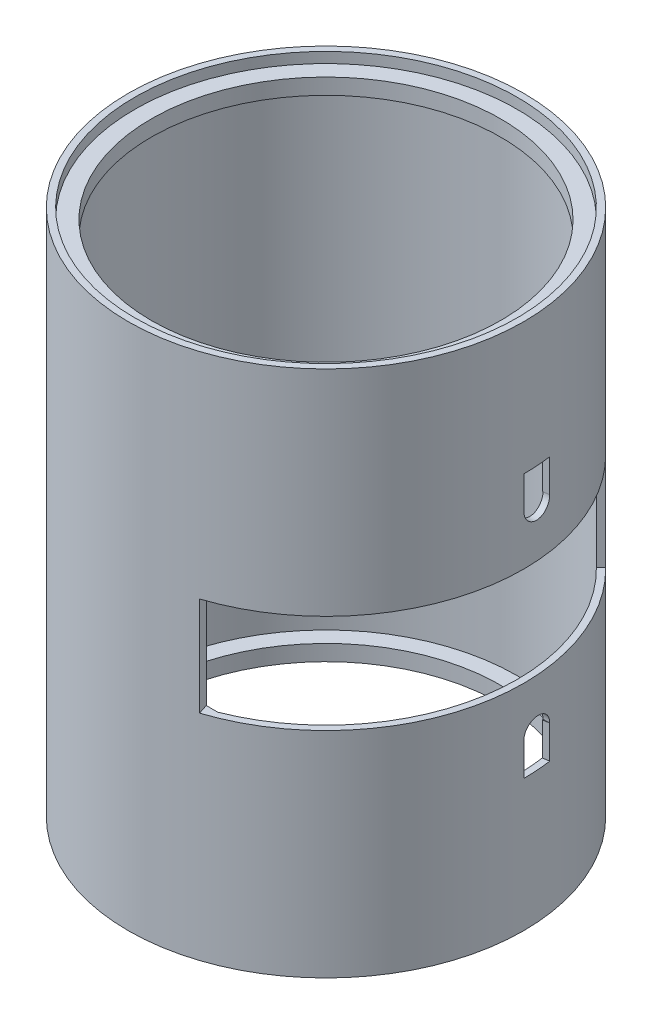
ISO-10303-21;
HEADER;
FILE_DESCRIPTION(('STEP AP214'),'2;1');
FILE_NAME('part.step','',(''),(''),'','','');
FILE_SCHEMA(('AUTOMOTIVE_DESIGN { 1 0 10303 214 1 1 1 1 }'));
ENDSEC;
DATA;
#1=APPLICATION_CONTEXT('core data for automotive mechanical design processes');
#2=APPLICATION_PROTOCOL_DEFINITION('international standard','automotive_design',2000,#1);
#3=PRODUCT_CONTEXT('',#1,'mechanical');
#4=PRODUCT('Part','Part','',(#3));
#5=PRODUCT_RELATED_PRODUCT_CATEGORY('part','',(#4));
#6=PRODUCT_DEFINITION_FORMATION('','',#4);
#7=PRODUCT_DEFINITION_CONTEXT('part definition',#1,'design');
#8=PRODUCT_DEFINITION('design','',#6,#7);
#9=PRODUCT_DEFINITION_SHAPE('','',#8);
#10=(LENGTH_UNIT() NAMED_UNIT(*) SI_UNIT(.MILLI.,.METRE.));
#11=(NAMED_UNIT(*) PLANE_ANGLE_UNIT() SI_UNIT($,.RADIAN.));
#12=(NAMED_UNIT(*) SI_UNIT($,.STERADIAN.) SOLID_ANGLE_UNIT());
#13=UNCERTAINTY_MEASURE_WITH_UNIT(LENGTH_MEASURE(1.E-05),#10,'distance_accuracy_value','');
#14=(GEOMETRIC_REPRESENTATION_CONTEXT(3) GLOBAL_UNCERTAINTY_ASSIGNED_CONTEXT((#13)) GLOBAL_UNIT_ASSIGNED_CONTEXT((#10,
#11,#12)) REPRESENTATION_CONTEXT('',''));
#15=CARTESIAN_POINT('',(0.,0.,0.));
#16=DIRECTION('',(0.,0.,1.));
#17=DIRECTION('',(1.,0.,0.));
#18=AXIS2_PLACEMENT_3D('',#15,#16,#17);
#19=CARTESIAN_POINT('',(0.,66.,0.));
#20=DIRECTION('',(0.,1.,0.));
#21=DIRECTION('',(0.,0.,1.));
#22=AXIS2_PLACEMENT_3D('',#19,#20,#21);
#23=CYLINDRICAL_SURFACE('',#22,29.);
#24=DIRECTION('',(0.,1.,0.));
#25=VECTOR('',#24,1.);
#26=CARTESIAN_POINT('',(28.70922832913,66.,-4.0963653091344));
#27=LINE('',#26,#25);
#28=CARTESIAN_POINT('',(28.70922832913,-15.,-4.0963653091344));
#29=VERTEX_POINT('',#28);
#30=CARTESIAN_POINT('',(28.70922832913,-20.,-4.0963653091344));
#31=VERTEX_POINT('',#30);
#32=EDGE_CURVE('E192',#29,#31,#27,.F.);
#33=ORIENTED_EDGE('',*,*,#32,.F.);
#34=CARTESIAN_POINT('',(0.,-15.,0.));
#35=DIRECTION('',(0.,-1.,0.));
#36=DIRECTION('',(0.,0.,-1.));
#37=AXIS2_PLACEMENT_3D('',#34,#35,#36);
#38=CIRCLE('',#37,29.);
#39=CARTESIAN_POINT('',(28.6887187373845,-15.,-4.23761928531155));
#40=VERTEX_POINT('',#39);
#41=EDGE_CURVE('E167',#29,#40,#38,.F.);
#42=ORIENTED_EDGE('',*,*,#41,.T.);
#43=CARTESIAN_POINT('',(28.6887187373845,-15.,-4.23761928531155));
#44=CARTESIAN_POINT('',(28.6887163589977,-14.9407150323902,-4.2376259303107));
#45=CARTESIAN_POINT('',(28.6890858616931,-14.8814312807168,-4.23513355215698));
#46=CARTESIAN_POINT('',(28.6905516992259,-14.7632685932158,-4.22519702092967));
#47=CARTESIAN_POINT('',(28.6916482831609,-14.7043898031151,-4.21775117079742));
#48=CARTESIAN_POINT('',(28.6945452791887,-14.587724371142,-4.19799529964819));
#49=CARTESIAN_POINT('',(28.6963427376136,-14.5299341991555,-4.18570568918496));
#50=CARTESIAN_POINT('',(28.7006075375052,-14.415630159259,-4.15636234677299));
#51=CARTESIAN_POINT('',(28.7030745801993,-14.359115734256,-4.13931073955937));
#52=CARTESIAN_POINT('',(28.7086024750182,-14.2483975261527,-4.10079470748535));
#53=CARTESIAN_POINT('',(28.7116558642416,-14.1941741798737,-4.07938555846366));
#54=CARTESIAN_POINT('',(28.7183198611446,-14.0877315464579,-4.03220418607597));
#55=CARTESIAN_POINT('',(28.7219303062085,-14.035511680003,-4.00643323579366));
#56=CARTESIAN_POINT('',(28.7335121494409,-13.8823542567541,-3.92281213685447));
#57=CARTESIAN_POINT('',(28.742238280664,-13.7848365176275,-3.85862499028679));
#58=CARTESIAN_POINT('',(28.761124681722,-13.6018035493329,-3.71522792727884));
#59=CARTESIAN_POINT('',(28.771284919382,-13.5162880509752,-3.63601834785989));
#60=CARTESIAN_POINT('',(28.7924191294219,-13.3594574757271,-3.46468416541786));
#61=CARTESIAN_POINT('',(28.8033930922198,-13.2881422316613,-3.37255971445956));
#62=CARTESIAN_POINT('',(28.8255232197304,-13.1616323985989,-3.17786047894853));
#63=CARTESIAN_POINT('',(28.8366793846844,-13.1064378309462,-3.0752856805597));
#64=CARTESIAN_POINT('',(28.8585867879493,-13.0136625371226,-2.86241263348916));
#65=CARTESIAN_POINT('',(28.869338021028,-12.9760820384755,-2.75211428506225));
#66=CARTESIAN_POINT('',(28.8899348411311,-12.9195922929702,-2.52674908069653));
#67=CARTESIAN_POINT('',(28.8997804101546,-12.9006834171577,-2.41168213004262));
#68=CARTESIAN_POINT('',(28.9181872862745,-12.8821060838537,-2.17989836631849));
#69=CARTESIAN_POINT('',(28.9267485667889,-12.882438024554,-2.06318151915338));
#70=CARTESIAN_POINT('',(28.9423538057861,-12.9023867299245,-1.83130055071363));
#71=CARTESIAN_POINT('',(28.9493977401963,-12.9220038005261,-1.71613645410056));
#72=CARTESIAN_POINT('',(28.9618885790109,-12.9800172148543,-1.49056229278237));
#73=CARTESIAN_POINT('',(28.9673356649018,-13.0184114231798,-1.38015168904667));
#74=CARTESIAN_POINT('',(28.976700574414,-13.1129355400831,-1.16713398335495));
#75=CARTESIAN_POINT('',(28.9806184001735,-13.1690654238645,-1.06452687048905));
#76=CARTESIAN_POINT('',(28.987112073701,-13.2975113716007,-0.869955930675817));
#77=CARTESIAN_POINT('',(28.9896879326261,-13.369827300977,-0.777992015245458));
#78=CARTESIAN_POINT('',(28.9937678599104,-13.5286421056691,-0.607235169945661));
#79=CARTESIAN_POINT('',(28.9952719409563,-13.6151408130849,-0.528442084178218));
#80=CARTESIAN_POINT('',(28.9975162144236,-13.7999396748211,-0.386173662927937));
#81=CARTESIAN_POINT('',(28.9982564160054,-13.8982396876048,-0.322698143764277));
#82=CARTESIAN_POINT('',(28.9992716464428,-14.103927999631,-0.212781683407579));
#83=CARTESIAN_POINT('',(28.999546679863,-14.2113162096814,-0.166340575061748));
#84=CARTESIAN_POINT('',(28.9998766274632,-14.4306387742128,-0.092301829126664));
#85=CARTESIAN_POINT('',(28.9999348147631,-14.5424795535625,-0.0644292536975952));
#86=CARTESIAN_POINT('',(28.999978433065,-14.7126185610112,-0.0364284877754208));
#87=CARTESIAN_POINT('',(28.9999856623384,-14.7698583878466,-0.0293961013521217));
#88=CARTESIAN_POINT('',(28.9999932935772,-14.884723660365,-0.0200115674832832));
#89=CARTESIAN_POINT('',(28.9999936951679,-14.9423491270448,-0.017659676988006));
#90=CARTESIAN_POINT('',(28.9999946231997,-15.,-0.0176593994366393));
#91=B_SPLINE_CURVE_WITH_KNOTS('',3,(#43,#44,#45,#46,#47,#48,#49,#50,#51,#52,#53,#54,#55,#56,#57,
#58,#59,#60,#61,#62,#63,#64,#65,#66,#67,#68,#69,#70,#71,#72,#73,#74,#75,#76,#77,#78,#79,#80,#81,
#82,#83,#84,#85,#86,#87,#88,#89,#90),.UNSPECIFIED.,.F.,.F.,(4,2,2,2,2,2,2,2,2,2,2,2,2,2,2,2,2,2,
2,2,2,2,2,4),(0.,0.177799626337657,0.355660198188265,0.532779182220553,0.709819264201134,
0.884739763575617,1.05960929647825,1.40908954213309,1.75856194828796,2.10803023996313,
2.45749899433526,2.80697226272767,3.15645247577147,3.50593992136609,3.8554329111738,
4.20488616466603,4.55433892958619,4.90378878909565,5.25323451200965,5.60267604433194,
5.95211414761337,6.29625588800382,6.4691005598412,6.6419547202583),.UNSPECIFIED.);
#92=CARTESIAN_POINT('',(28.9999946231997,-15.,-0.0176593994366396));
#93=VERTEX_POINT('',#92);
#94=EDGE_CURVE('E178',#40,#93,#91,.T.);
#95=ORIENTED_EDGE('',*,*,#94,.T.);
#96=CARTESIAN_POINT('',(0.,-15.,0.));
#97=DIRECTION('',(0.,-1.,0.));
#98=DIRECTION('',(0.,0.,-1.));
#99=AXIS2_PLACEMENT_3D('',#96,#97,#98);
#100=CIRCLE('',#99,29.);
#101=CARTESIAN_POINT('',(28.9999949756789,-15.,-0.0170707527887516));
#102=VERTEX_POINT('',#101);
#103=EDGE_CURVE('E476',#102,#93,#100,.F.);
#104=ORIENTED_EDGE('',*,*,#103,.F.);
#105=DIRECTION('',(0.,1.,0.));
#106=VECTOR('',#105,1.);
#107=CARTESIAN_POINT('',(28.9999949756789,66.,-0.0170707527887516));
#108=LINE('',#107,#106);
#109=CARTESIAN_POINT('',(28.9999949756789,-20.,-0.0170707527887516));
#110=VERTEX_POINT('',#109);
#111=EDGE_CURVE('E201',#110,#102,#108,.T.);
#112=ORIENTED_EDGE('',*,*,#111,.F.);
#113=CARTESIAN_POINT('',(0.,-20.,0.));
#114=DIRECTION('',(0.,-1.,0.));
#115=DIRECTION('',(0.,0.,-1.));
#116=AXIS2_PLACEMENT_3D('',#113,#114,#115);
#117=CIRCLE('',#116,29.);
#118=EDGE_CURVE('E388',#110,#31,#117,.F.);
#119=ORIENTED_EDGE('',*,*,#118,.T.);
#120=EDGE_LOOP('',(#33,#42,#95,#104,#112,#119));
#121=FACE_BOUND('',#120,.T.);
#122=CARTESIAN_POINT('',(0.,7.5,0.));
#123=DIRECTION('',(0.,-1.,0.));
#124=DIRECTION('',(0.,0.,-1.));
#125=AXIS2_PLACEMENT_3D('',#122,#123,#124);
#126=CIRCLE('',#125,29.);
#127=CARTESIAN_POINT('',(10.5830052442584,7.5,27.));
#128=VERTEX_POINT('',#127);
#129=CARTESIAN_POINT('',(20.3182089521525,7.5,-20.6922783901791));
#130=VERTEX_POINT('',#129);
#131=EDGE_CURVE('E351',#128,#130,#126,.F.);
#132=ORIENTED_EDGE('',*,*,#131,.F.);
#133=DIRECTION('',(0.,1.,0.));
#134=VECTOR('',#133,1.);
#135=CARTESIAN_POINT('',(10.5830052442584,66.,27.));
#136=LINE('',#135,#134);
#137=CARTESIAN_POINT('',(10.5830052442584,36.,27.));
#138=VERTEX_POINT('',#137);
#139=EDGE_CURVE('E335',#138,#128,#136,.F.);
#140=ORIENTED_EDGE('',*,*,#139,.F.);
#141=CARTESIAN_POINT('',(0.,36.,0.));
#142=DIRECTION('',(0.,1.,0.));
#143=DIRECTION('',(0.,0.,1.));
#144=AXIS2_PLACEMENT_3D('',#141,#142,#143);
#145=CIRCLE('',#144,29.);
#146=CARTESIAN_POINT('',(-10.5830052442584,36.,27.));
#147=VERTEX_POINT('',#146);
#148=EDGE_CURVE('E306',#138,#147,#145,.T.);
#149=ORIENTED_EDGE('',*,*,#148,.T.);
#150=DIRECTION('',(0.,1.,0.));
#151=VECTOR('',#150,1.);
#152=CARTESIAN_POINT('',(-10.5830052442584,66.,27.));
#153=LINE('',#152,#151);
#154=CARTESIAN_POINT('',(-10.5830052442584,-36.,27.));
#155=VERTEX_POINT('',#154);
#156=EDGE_CURVE('E339',#155,#147,#153,.T.);
#157=ORIENTED_EDGE('',*,*,#156,.F.);
#158=CARTESIAN_POINT('',(0.,-36.,0.));
#159=DIRECTION('',(0.,1.,0.));
#160=DIRECTION('',(0.,0.,1.));
#161=AXIS2_PLACEMENT_3D('',#158,#159,#160);
#162=CIRCLE('',#161,29.);
#163=CARTESIAN_POINT('',(10.5830052442584,-36.,27.));
#164=VERTEX_POINT('',#163);
#165=EDGE_CURVE('E324',#164,#155,#162,.T.);
#166=ORIENTED_EDGE('',*,*,#165,.F.);
#167=CARTESIAN_POINT('',(10.5830052442584,-7.50000000000001,27.));
#168=VERTEX_POINT('',#167);
#169=EDGE_CURVE('E338',#168,#164,#136,.F.);
#170=ORIENTED_EDGE('',*,*,#169,.F.);
#171=CARTESIAN_POINT('',(0.,-7.50000000000001,0.));
#172=DIRECTION('',(0.,-1.,0.));
#173=DIRECTION('',(0.,0.,-1.));
#174=AXIS2_PLACEMENT_3D('',#171,#172,#173);
#175=CIRCLE('',#174,29.);
#176=CARTESIAN_POINT('',(20.3182089521525,-7.50000000000001,-20.6922783901791));
#177=VERTEX_POINT('',#176);
#178=EDGE_CURVE('E356',#168,#177,#175,.F.);
#179=ORIENTED_EDGE('',*,*,#178,.T.);
#180=DIRECTION('',(0.,1.,0.));
#181=VECTOR('',#180,1.);
#182=CARTESIAN_POINT('',(20.3182089521525,66.,-20.6922783901791));
#183=LINE('',#182,#181);
#184=EDGE_CURVE('E344',#130,#177,#183,.F.);
#185=ORIENTED_EDGE('',*,*,#184,.F.);
#186=EDGE_LOOP('',(#132,#140,#149,#157,#166,#170,#179,#185));
#187=FACE_BOUND('',#186,.T.);
#188=CARTESIAN_POINT('',(0.,15.,0.));
#189=DIRECTION('',(0.,-1.,0.));
#190=DIRECTION('',(0.,0.,-1.));
#191=AXIS2_PLACEMENT_3D('',#188,#189,#190);
#192=CIRCLE('',#191,29.);
#193=CARTESIAN_POINT('',(28.70922832913,15.,-4.09636530913441));
#194=VERTEX_POINT('',#193);
#195=CARTESIAN_POINT('',(28.6887187373845,15.,-4.23761928531155));
#196=VERTEX_POINT('',#195);
#197=EDGE_CURVE('E257',#194,#196,#192,.F.);
#198=ORIENTED_EDGE('',*,*,#197,.F.);
#199=DIRECTION('',(0.,1.,0.));
#200=VECTOR('',#199,1.);
#201=CARTESIAN_POINT('',(28.70922832913,66.,-4.0963653091344));
#202=LINE('',#201,#200);
#203=CARTESIAN_POINT('',(28.70922832913,20.,-4.0963653091344));
#204=VERTEX_POINT('',#203);
#205=EDGE_CURVE('E273',#194,#204,#202,.T.);
#206=ORIENTED_EDGE('',*,*,#205,.T.);
#207=CARTESIAN_POINT('',(0.,20.,0.));
#208=DIRECTION('',(0.,1.,0.));
#209=DIRECTION('',(0.,0.,1.));
#210=AXIS2_PLACEMENT_3D('',#207,#208,#209);
#211=CIRCLE('',#210,29.);
#212=CARTESIAN_POINT('',(28.9999949756789,20.,-0.0170707527887516));
#213=VERTEX_POINT('',#212);
#214=EDGE_CURVE('E370',#204,#213,#211,.F.);
#215=ORIENTED_EDGE('',*,*,#214,.T.);
#216=DIRECTION('',(0.,1.,0.));
#217=VECTOR('',#216,1.);
#218=CARTESIAN_POINT('',(28.9999949756789,66.,-0.0170707527887516));
#219=LINE('',#218,#217);
#220=CARTESIAN_POINT('',(28.9999949756789,15.,-0.0170707527887516));
#221=VERTEX_POINT('',#220);
#222=EDGE_CURVE('E375',#213,#221,#219,.F.);
#223=ORIENTED_EDGE('',*,*,#222,.T.);
#224=CARTESIAN_POINT('',(0.,15.,0.));
#225=DIRECTION('',(0.,1.,0.));
#226=DIRECTION('',(0.,0.,1.));
#227=AXIS2_PLACEMENT_3D('',#224,#225,#226);
#228=CIRCLE('',#227,29.);
#229=CARTESIAN_POINT('',(28.9999946231997,15.,-0.0176593994366396));
#230=VERTEX_POINT('',#229);
#231=EDGE_CURVE('E373',#230,#221,#228,.F.);
#232=ORIENTED_EDGE('',*,*,#231,.F.);
#233=CARTESIAN_POINT('',(28.6887187373845,15.,-4.23761928531155));
#234=CARTESIAN_POINT('',(28.6887163589977,14.9407150323902,-4.2376259303107));
#235=CARTESIAN_POINT('',(28.6890858616931,14.8814312807168,-4.23513355215698));
#236=CARTESIAN_POINT('',(28.6905516992259,14.7632685932158,-4.22519702092967));
#237=CARTESIAN_POINT('',(28.6916482831609,14.7043898031151,-4.21775117079742));
#238=CARTESIAN_POINT('',(28.6945452791887,14.587724371142,-4.19799529964819));
#239=CARTESIAN_POINT('',(28.6963427376136,14.5299341991555,-4.18570568918496));
#240=CARTESIAN_POINT('',(28.7006075375052,14.415630159259,-4.15636234677299));
#241=CARTESIAN_POINT('',(28.7030745801993,14.359115734256,-4.13931073955937));
#242=CARTESIAN_POINT('',(28.7086024750182,14.2483975261527,-4.10079470748535));
#243=CARTESIAN_POINT('',(28.7116558642416,14.1941741798737,-4.07938555846366));
#244=CARTESIAN_POINT('',(28.7183198611446,14.0877315464579,-4.03220418607597));
#245=CARTESIAN_POINT('',(28.7219303062085,14.035511680003,-4.00643323579366));
#246=CARTESIAN_POINT('',(28.7335121494409,13.8823542567541,-3.92281213685447));
#247=CARTESIAN_POINT('',(28.742238280664,13.7848365176275,-3.85862499028679));
#248=CARTESIAN_POINT('',(28.761124681722,13.6018035493329,-3.71522792727884));
#249=CARTESIAN_POINT('',(28.771284919382,13.5162880509752,-3.63601834785989));
#250=CARTESIAN_POINT('',(28.7924191294219,13.3594574757271,-3.46468416541786));
#251=CARTESIAN_POINT('',(28.8033930922198,13.2881422316613,-3.37255971445956));
#252=CARTESIAN_POINT('',(28.8255232197304,13.1616323985989,-3.17786047894853));
#253=CARTESIAN_POINT('',(28.8366793846844,13.1064378309462,-3.0752856805597));
#254=CARTESIAN_POINT('',(28.8585867879493,13.0136625371226,-2.86241263348916));
#255=CARTESIAN_POINT('',(28.869338021028,12.9760820384755,-2.75211428506225));
#256=CARTESIAN_POINT('',(28.8899348411311,12.9195922929702,-2.52674908069653));
#257=CARTESIAN_POINT('',(28.8997804101546,12.9006834171577,-2.41168213004262));
#258=CARTESIAN_POINT('',(28.9181872862745,12.8821060838537,-2.17989836631849));
#259=CARTESIAN_POINT('',(28.9267485667889,12.882438024554,-2.06318151915338));
#260=CARTESIAN_POINT('',(28.9423538057861,12.9023867299245,-1.83130055071363));
#261=CARTESIAN_POINT('',(28.9493977401963,12.9220038005261,-1.71613645410056));
#262=CARTESIAN_POINT('',(28.9618885790109,12.9800172148543,-1.49056229278237));
#263=CARTESIAN_POINT('',(28.9673356649018,13.0184114231798,-1.38015168904667));
#264=CARTESIAN_POINT('',(28.976700574414,13.1129355400831,-1.16713398335495));
#265=CARTESIAN_POINT('',(28.9806184001735,13.1690654238645,-1.06452687048905));
#266=CARTESIAN_POINT('',(28.987112073701,13.2975113716007,-0.869955930675817));
#267=CARTESIAN_POINT('',(28.9896879326261,13.369827300977,-0.777992015245458));
#268=CARTESIAN_POINT('',(28.9937678599104,13.5286421056691,-0.607235169945661));
#269=CARTESIAN_POINT('',(28.9952719409563,13.6151408130849,-0.528442084178218));
#270=CARTESIAN_POINT('',(28.9975162144236,13.7999396748211,-0.386173662927937));
#271=CARTESIAN_POINT('',(28.9982564160054,13.8982396876048,-0.322698143764277));
#272=CARTESIAN_POINT('',(28.9992716464428,14.103927999631,-0.212781683407579));
#273=CARTESIAN_POINT('',(28.999546679863,14.2113162096814,-0.166340575061748));
#274=CARTESIAN_POINT('',(28.9998766274632,14.4306387742128,-0.092301829126664));
#275=CARTESIAN_POINT('',(28.9999348147631,14.5424795535625,-0.0644292536975952));
#276=CARTESIAN_POINT('',(28.999978433065,14.7126185610112,-0.0364284877754208));
#277=CARTESIAN_POINT('',(28.9999856623384,14.7698583878466,-0.0293961013521217));
#278=CARTESIAN_POINT('',(28.9999932935772,14.884723660365,-0.0200115674832832));
#279=CARTESIAN_POINT('',(28.9999936951679,14.9423491270448,-0.017659676988006));
#280=CARTESIAN_POINT('',(28.9999946231997,15.,-0.0176593994366393));
#281=B_SPLINE_CURVE_WITH_KNOTS('',3,(#233,#234,#235,#236,#237,#238,#239,#240,#241,#242,#243,
#244,#245,#246,#247,#248,#249,#250,#251,#252,#253,#254,#255,#256,#257,#258,#259,#260,#261,#262,
#263,#264,#265,#266,#267,#268,#269,#270,#271,#272,#273,#274,#275,#276,#277,#278,#279,#280),
.UNSPECIFIED.,.F.,.F.,(4,2,2,2,2,2,2,2,2,2,2,2,2,2,2,2,2,2,2,2,2,2,2,4),(0.,0.177799626337657,
0.355660198188265,0.532779182220553,0.709819264201134,0.884739763575617,1.05960929647825,
1.40908954213309,1.75856194828796,2.10803023996313,2.45749899433526,2.80697226272767,
3.15645247577147,3.50593992136609,3.8554329111738,4.20488616466603,4.55433892958619,
4.90378878909565,5.25323451200965,5.60267604433194,5.95211414761337,6.29625588800382,
6.4691005598412,6.6419547202583),.UNSPECIFIED.);
#282=EDGE_CURVE('E195',#196,#230,#281,.T.);
#283=ORIENTED_EDGE('',*,*,#282,.F.);
#284=EDGE_LOOP('',(#198,#206,#215,#223,#232,#283));
#285=FACE_BOUND('',#284,.T.);
#286=ADVANCED_FACE('F41',(#121,#187,#285),#23,.F.);
#287=CARTESIAN_POINT('',(0.,66.,0.));
#288=DIRECTION('',(0.,1.,0.));
#289=DIRECTION('',(0.,0.,1.));
#290=AXIS2_PLACEMENT_3D('',#287,#288,#289);
#291=CYLINDRICAL_SURFACE('',#290,30.);
#292=DIRECTION('',(0.,1.,0.));
#293=VECTOR('',#292,1.);
#294=CARTESIAN_POINT('',(29.9999948024264,66.,-0.0176593994366396));
#295=LINE('',#294,#293);
#296=CARTESIAN_POINT('',(29.9999948424772,-15.,-0.0176593994484274));
#297=VERTEX_POINT('',#296);
#298=CARTESIAN_POINT('',(29.9999948024264,-20.,-0.0176593994366396));
#299=VERTEX_POINT('',#298);
#300=EDGE_CURVE('E187',#297,#299,#295,.F.);
#301=ORIENTED_EDGE('',*,*,#300,.F.);
#302=CARTESIAN_POINT('',(29.9999948024264,-15.,-0.0176593994366393));
#303=CARTESIAN_POINT('',(29.9999938402962,-14.9412532095579,-0.0176598657236777));
#304=CARTESIAN_POINT('',(29.999993474151,-14.8825337768758,-0.0201019547507206));
#305=CARTESIAN_POINT('',(29.9999857361238,-14.7655018417622,-0.0298457423130979));
#306=CARTESIAN_POINT('',(29.9999783645095,-14.7071893238691,-0.0371472551767847));
#307=CARTESIAN_POINT('',(29.9999334714581,-14.5334811349494,-0.0662894089645583));
#308=CARTESIAN_POINT('',(29.999873197751,-14.4192148298836,-0.0953677519138441));
#309=CARTESIAN_POINT('',(29.9995311008577,-14.1972102976741,-0.171996865782758));
#310=CARTESIAN_POINT('',(29.9992494391952,-14.0894673728035,-0.219534156350834));
#311=CARTESIAN_POINT('',(29.9982181939357,-13.8834630208301,-0.331716828260493));
#312=CARTESIAN_POINT('',(29.9974692443214,-13.7851889552688,-0.396338961777341));
#313=CARTESIAN_POINT('',(29.9952112308201,-13.6008557644937,-0.540832034384079));
#314=CARTESIAN_POINT('',(29.9937034434102,-13.5147764365155,-0.620677226399811));
#315=CARTESIAN_POINT('',(29.9896319947125,-13.3571559414668,-0.793348866898094));
#316=CARTESIAN_POINT('',(29.987070122849,-13.285590441477,-0.886153140381547));
#317=CARTESIAN_POINT('',(29.9806356443442,-13.1588837818133,-1.08216214718309));
#318=CARTESIAN_POINT('',(29.9767646881107,-13.103722105036,-1.18535367044797));
#319=CARTESIAN_POINT('',(29.9675374908111,-13.0112423759765,-1.39933901766303));
#320=CARTESIAN_POINT('',(29.9621817843042,-12.9739179148566,-1.51013009473923));
#321=CARTESIAN_POINT('',(29.94992764375,-12.9180971645588,-1.73627466759805));
#322=CARTESIAN_POINT('',(29.943029216466,-12.8996007928401,-1.85162814337718));
#323=CARTESIAN_POINT('',(29.9277745066298,-12.8819096813453,-2.08370685514481));
#324=CARTESIAN_POINT('',(29.9194182427162,-12.8827146948153,-2.20043207357752));
#325=CARTESIAN_POINT('',(29.901481857603,-12.9035540711115,-2.43205226935362));
#326=CARTESIAN_POINT('',(29.891901759221,-12.923588075471,-2.54694728077512));
#327=CARTESIAN_POINT('',(29.8718917519049,-12.9822888187374,-2.77179177648303));
#328=CARTESIAN_POINT('',(29.8614618596495,-13.020955192021,-2.88174135776739));
#329=CARTESIAN_POINT('',(29.8402428949968,-13.1158355541731,-3.09374601889894));
#330=CARTESIAN_POINT('',(29.8294538279077,-13.1720492838058,-3.19580121534594));
#331=CARTESIAN_POINT('',(29.8080884433198,-13.3005027772115,-3.38929953159942));
#332=CARTESIAN_POINT('',(29.7975121247615,-13.3727424611698,-3.48074270425398));
#333=CARTESIAN_POINT('',(29.7771840663256,-13.5312988168637,-3.65056669443879));
#334=CARTESIAN_POINT('',(29.7674323323703,-13.6176155896935,-3.72894741815338));
#335=CARTESIAN_POINT('',(29.7493510930768,-13.8021013473452,-3.87055853217645));
#336=CARTESIAN_POINT('',(29.7410216135238,-13.9002705469942,-3.93378864781595));
#337=CARTESIAN_POINT('',(29.7300068227944,-14.0542748758647,-4.0158999371425));
#338=CARTESIAN_POINT('',(29.7265808012157,-14.106755462487,-4.04115505612639));
#339=CARTESIAN_POINT('',(29.7202735461212,-14.213674254277,-4.08728318308908));
#340=CARTESIAN_POINT('',(29.7173924661816,-14.2681130061683,-4.10815495592966));
#341=CARTESIAN_POINT('',(29.7122729137076,-14.3775712645196,-4.14501855078707));
#342=CARTESIAN_POINT('',(29.7100239925065,-14.4325635424816,-4.16109003382978));
#343=CARTESIAN_POINT('',(29.7061383057697,-14.5437127494879,-4.18873976956641));
#344=CARTESIAN_POINT('',(29.7045017895105,-14.599870142992,-4.2003161926397));
#345=CARTESIAN_POINT('',(29.7018655754222,-14.7131688460137,-4.2189187309629));
#346=CARTESIAN_POINT('',(29.7008683352752,-14.7703130956062,-4.22592728685775));
#347=CARTESIAN_POINT('',(29.6995354984244,-14.8849712836924,-4.23527974381886));
#348=CARTESIAN_POINT('',(29.6991996919224,-14.9424850991557,-4.23762512398667));
#349=CARTESIAN_POINT('',(29.6992017197896,-15.,-4.23761928531155));
#350=B_SPLINE_CURVE_WITH_KNOTS('',3,(#302,#303,#304,#305,#306,#307,#308,#309,#310,#311,#312,
#313,#314,#315,#316,#317,#318,#319,#320,#321,#322,#323,#324,#325,#326,#327,#328,#329,#330,#331,
#332,#333,#334,#335,#336,#337,#338,#339,#340,#341,#342,#343,#344,#345,#346,#347,#348,#349),
.UNSPECIFIED.,.F.,.F.,(4,2,2,2,2,2,2,2,2,2,2,2,2,2,2,2,2,2,2,2,2,2,2,4),(0.,0.176135253257834,
0.352263777025421,0.704224533866919,1.05592873986659,1.40715681348034,1.75779603457731,
2.10784244703736,2.45744917903004,2.80693020415864,3.15640969718469,3.50588472237893,
3.85535323278993,4.20481488585529,4.5542713763967,4.90372612656329,5.25318338643674,
5.60264698122469,5.77750855983133,5.95241934497637,6.1242416071281,6.29613373282857,
6.46868279220872,6.641177112429),.UNSPECIFIED.);
#351=CARTESIAN_POINT('',(29.6992017197903,-15.,-4.23761928531155));
#352=VERTEX_POINT('',#351);
#353=EDGE_CURVE('E175',#297,#352,#350,.T.);
#354=ORIENTED_EDGE('',*,*,#353,.T.);
#355=DIRECTION('',(0.,1.,0.));
#356=VECTOR('',#355,1.);
#357=CARTESIAN_POINT('',(29.6992017197896,66.,-4.23761928531145));
#358=LINE('',#357,#356);
#359=CARTESIAN_POINT('',(29.6992017197896,-20.,-4.23761928531145));
#360=VERTEX_POINT('',#359);
#361=EDGE_CURVE('E12',#360,#352,#358,.T.);
#362=ORIENTED_EDGE('',*,*,#361,.F.);
#363=CARTESIAN_POINT('',(0.,-20.,0.));
#364=DIRECTION('',(0.,-1.,0.));
#365=DIRECTION('',(0.,0.,-1.));
#366=AXIS2_PLACEMENT_3D('',#363,#364,#365);
#367=CIRCLE('',#366,30.);
#368=EDGE_CURVE('E50',#360,#299,#367,.T.);
#369=ORIENTED_EDGE('',*,*,#368,.T.);
#370=EDGE_LOOP('',(#301,#354,#362,#369));
#371=FACE_BOUND('',#370,.T.);
#372=CARTESIAN_POINT('',(0.,-40.,0.));
#373=DIRECTION('',(0.,1.,0.));
#374=DIRECTION('',(0.,0.,1.));
#375=AXIS2_PLACEMENT_3D('',#372,#373,#374);
#376=CIRCLE('',#375,30.);
#377=CARTESIAN_POINT('',(0.,-40.,30.));
#378=VERTEX_POINT('',#377);
#379=EDGE_CURVE('E326',#378,#378,#376,.T.);
#380=ORIENTED_EDGE('',*,*,#379,.T.);
#381=EDGE_LOOP('',(#380));
#382=FACE_BOUND('',#381,.T.);
#383=CARTESIAN_POINT('',(0.,40.,0.));
#384=DIRECTION('',(0.,1.,0.));
#385=DIRECTION('',(0.,0.,1.));
#386=AXIS2_PLACEMENT_3D('',#383,#384,#385);
#387=CIRCLE('',#386,30.);
#388=CARTESIAN_POINT('',(0.,40.,30.));
#389=VERTEX_POINT('',#388);
#390=EDGE_CURVE('E309',#389,#389,#387,.T.);
#391=ORIENTED_EDGE('',*,*,#390,.F.);
#392=EDGE_LOOP('',(#391));
#393=FACE_BOUND('',#392,.T.);
#394=CARTESIAN_POINT('',(0.,7.5,0.));
#395=DIRECTION('',(0.,-1.,0.));
#396=DIRECTION('',(0.,0.,-1.));
#397=AXIS2_PLACEMENT_3D('',#394,#395,#396);
#398=CIRCLE('',#397,30.);
#399=CARTESIAN_POINT('',(21.0188368470543,7.5,-21.4058052312197));
#400=VERTEX_POINT('',#399);
#401=CARTESIAN_POINT('',(9.33326921208829,7.5,28.5112273642277));
#402=VERTEX_POINT('',#401);
#403=EDGE_CURVE('E349',#400,#402,#398,.T.);
#404=ORIENTED_EDGE('',*,*,#403,.F.);
#405=DIRECTION('',(0.,1.,0.));
#406=VECTOR('',#405,1.);
#407=CARTESIAN_POINT('',(21.0188368470543,66.,-21.4058052312197));
#408=LINE('',#407,#406);
#409=CARTESIAN_POINT('',(21.0188368470543,-7.50000000000001,-21.4058052312197));
#410=VERTEX_POINT('',#409);
#411=EDGE_CURVE('E279',#410,#400,#408,.T.);
#412=ORIENTED_EDGE('',*,*,#411,.F.);
#413=CARTESIAN_POINT('',(0.,-7.50000000000001,0.));
#414=DIRECTION('',(0.,-1.,0.));
#415=DIRECTION('',(0.,0.,-1.));
#416=AXIS2_PLACEMENT_3D('',#413,#414,#415);
#417=CIRCLE('',#416,30.);
#418=CARTESIAN_POINT('',(9.33326921208829,-7.50000000000001,28.5112273642277));
#419=VERTEX_POINT('',#418);
#420=EDGE_CURVE('E353',#410,#419,#417,.T.);
#421=ORIENTED_EDGE('',*,*,#420,.T.);
#422=DIRECTION('',(0.,1.,0.));
#423=VECTOR('',#422,1.);
#424=CARTESIAN_POINT('',(9.33326921208828,66.,28.5112273642277));
#425=LINE('',#424,#423);
#426=EDGE_CURVE('E346',#402,#419,#425,.F.);
#427=ORIENTED_EDGE('',*,*,#426,.F.);
#428=EDGE_LOOP('',(#404,#412,#421,#427));
#429=FACE_BOUND('',#428,.T.);
#430=CARTESIAN_POINT('',(29.9999948024264,15.,-0.0176593994366393));
#431=CARTESIAN_POINT('',(29.9999938402962,14.9412532095579,-0.0176598657236777));
#432=CARTESIAN_POINT('',(29.999993474151,14.8825337768758,-0.0201019547507206));
#433=CARTESIAN_POINT('',(29.9999857361238,14.7655018417622,-0.0298457423130979));
#434=CARTESIAN_POINT('',(29.9999783645095,14.7071893238691,-0.0371472551767847));
#435=CARTESIAN_POINT('',(29.9999334714581,14.5334811349494,-0.0662894089645583));
#436=CARTESIAN_POINT('',(29.999873197751,14.4192148298836,-0.0953677519138441));
#437=CARTESIAN_POINT('',(29.9995311008577,14.1972102976741,-0.171996865782758));
#438=CARTESIAN_POINT('',(29.9992494391952,14.0894673728035,-0.219534156350834));
#439=CARTESIAN_POINT('',(29.9982181939357,13.8834630208301,-0.331716828260493));
#440=CARTESIAN_POINT('',(29.9974692443214,13.7851889552688,-0.396338961777341));
#441=CARTESIAN_POINT('',(29.9952112308201,13.6008557644937,-0.540832034384079));
#442=CARTESIAN_POINT('',(29.9937034434102,13.5147764365155,-0.620677226399811));
#443=CARTESIAN_POINT('',(29.9896319947125,13.3571559414668,-0.793348866898094));
#444=CARTESIAN_POINT('',(29.987070122849,13.285590441477,-0.886153140381547));
#445=CARTESIAN_POINT('',(29.9806356443442,13.1588837818133,-1.08216214718309));
#446=CARTESIAN_POINT('',(29.9767646881107,13.103722105036,-1.18535367044797));
#447=CARTESIAN_POINT('',(29.9675374908111,13.0112423759765,-1.39933901766303));
#448=CARTESIAN_POINT('',(29.9621817843042,12.9739179148566,-1.51013009473923));
#449=CARTESIAN_POINT('',(29.94992764375,12.9180971645588,-1.73627466759805));
#450=CARTESIAN_POINT('',(29.943029216466,12.8996007928401,-1.85162814337718));
#451=CARTESIAN_POINT('',(29.9277745066298,12.8819096813453,-2.08370685514481));
#452=CARTESIAN_POINT('',(29.9194182427162,12.8827146948153,-2.20043207357752));
#453=CARTESIAN_POINT('',(29.901481857603,12.9035540711115,-2.43205226935362));
#454=CARTESIAN_POINT('',(29.891901759221,12.923588075471,-2.54694728077512));
#455=CARTESIAN_POINT('',(29.8718917519049,12.9822888187374,-2.77179177648303));
#456=CARTESIAN_POINT('',(29.8614618596495,13.020955192021,-2.88174135776739));
#457=CARTESIAN_POINT('',(29.8402428949968,13.1158355541731,-3.09374601889894));
#458=CARTESIAN_POINT('',(29.8294538279077,13.1720492838058,-3.19580121534594));
#459=CARTESIAN_POINT('',(29.8080884433198,13.3005027772115,-3.38929953159942));
#460=CARTESIAN_POINT('',(29.7975121247615,13.3727424611698,-3.48074270425398));
#461=CARTESIAN_POINT('',(29.7771840663256,13.5312988168637,-3.65056669443879));
#462=CARTESIAN_POINT('',(29.7674323323703,13.6176155896935,-3.72894741815338));
#463=CARTESIAN_POINT('',(29.7493510930768,13.8021013473452,-3.87055853217645));
#464=CARTESIAN_POINT('',(29.7410216135238,13.9002705469942,-3.93378864781595));
#465=CARTESIAN_POINT('',(29.7300068227944,14.0542748758647,-4.0158999371425));
#466=CARTESIAN_POINT('',(29.7265808012157,14.106755462487,-4.04115505612639));
#467=CARTESIAN_POINT('',(29.7202735461212,14.213674254277,-4.08728318308908));
#468=CARTESIAN_POINT('',(29.7173924661816,14.2681130061683,-4.10815495592966));
#469=CARTESIAN_POINT('',(29.7122729137076,14.3775712645196,-4.14501855078707));
#470=CARTESIAN_POINT('',(29.7100239925065,14.4325635424816,-4.16109003382978));
#471=CARTESIAN_POINT('',(29.7061383057697,14.5437127494879,-4.18873976956641));
#472=CARTESIAN_POINT('',(29.7045017895105,14.599870142992,-4.2003161926397));
#473=CARTESIAN_POINT('',(29.7018655754222,14.7131688460137,-4.2189187309629));
#474=CARTESIAN_POINT('',(29.7008683352752,14.7703130956062,-4.22592728685775));
#475=CARTESIAN_POINT('',(29.6995354984244,14.8849712836924,-4.23527974381886));
#476=CARTESIAN_POINT('',(29.6991996919224,14.9424850991557,-4.23762512398667));
#477=CARTESIAN_POINT('',(29.6992017197896,15.,-4.23761928531155));
#478=B_SPLINE_CURVE_WITH_KNOTS('',3,(#430,#431,#432,#433,#434,#435,#436,#437,#438,#439,#440,
#441,#442,#443,#444,#445,#446,#447,#448,#449,#450,#451,#452,#453,#454,#455,#456,#457,#458,#459,
#460,#461,#462,#463,#464,#465,#466,#467,#468,#469,#470,#471,#472,#473,#474,#475,#476,#477),
.UNSPECIFIED.,.F.,.F.,(4,2,2,2,2,2,2,2,2,2,2,2,2,2,2,2,2,2,2,2,2,2,2,4),(0.,0.176135253257834,
0.352263777025421,0.704224533866919,1.05592873986659,1.40715681348034,1.75779603457731,
2.10784244703736,2.45744917903004,2.80693020415864,3.15640969718469,3.50588472237893,
3.85535323278993,4.20481488585529,4.5542713763967,4.90372612656329,5.25318338643674,
5.60264698122469,5.77750855983133,5.95241934497637,6.1242416071281,6.29613373282857,
6.46868279220872,6.641177112429),.UNSPECIFIED.);
#479=CARTESIAN_POINT('',(29.9999948424772,15.,-0.0176593994484274));
#480=VERTEX_POINT('',#479);
#481=CARTESIAN_POINT('',(29.6992017197896,15.,-4.23761928531145));
#482=VERTEX_POINT('',#481);
#483=EDGE_CURVE('E197',#480,#482,#478,.T.);
#484=ORIENTED_EDGE('',*,*,#483,.F.);
#485=DIRECTION('',(0.,1.,0.));
#486=VECTOR('',#485,1.);
#487=CARTESIAN_POINT('',(29.9999948024264,66.,-0.0176593994366396));
#488=LINE('',#487,#486);
#489=CARTESIAN_POINT('',(29.9999948024264,20.,-0.0176593994366396));
#490=VERTEX_POINT('',#489);
#491=EDGE_CURVE('E281',#480,#490,#488,.T.);
#492=ORIENTED_EDGE('',*,*,#491,.T.);
#493=CARTESIAN_POINT('',(0.,20.,0.));
#494=DIRECTION('',(0.,1.,0.));
#495=DIRECTION('',(0.,0.,1.));
#496=AXIS2_PLACEMENT_3D('',#493,#494,#495);
#497=CIRCLE('',#496,30.);
#498=CARTESIAN_POINT('',(29.6992017197896,20.,-4.23761928531145));
#499=VERTEX_POINT('',#498);
#500=EDGE_CURVE('E278',#490,#499,#497,.T.);
#501=ORIENTED_EDGE('',*,*,#500,.T.);
#502=DIRECTION('',(0.,1.,0.));
#503=VECTOR('',#502,1.);
#504=CARTESIAN_POINT('',(29.6992017197896,66.,-4.23761928531145));
#505=LINE('',#504,#503);
#506=EDGE_CURVE('E271',#499,#482,#505,.F.);
#507=ORIENTED_EDGE('',*,*,#506,.T.);
#508=EDGE_LOOP('',(#484,#492,#501,#507));
#509=FACE_BOUND('',#508,.T.);
#510=ADVANCED_FACE('F184',(#371,#382,#393,#429,#509),#291,.T.);
#511=CARTESIAN_POINT('',(0.,15.,0.));
#512=DIRECTION('',(0.,1.,0.));
#513=DIRECTION('',(0.,0.,1.));
#514=AXIS2_PLACEMENT_3D('',#511,#512,#513);
#515=PLANE('',#514);
#516=DIRECTION('',(0.999999826747547,0.,-0.000588646647887985));
#517=VECTOR('',#516,1.);
#518=CARTESIAN_POINT('',(0.,15.,0.));
#519=LINE('',#518,#517);
#520=EDGE_CURVE('E378',#221,#480,#519,.T.);
#521=ORIENTED_EDGE('',*,*,#520,.T.);
#522=DIRECTION('',(-1.,0.,0.));
#523=VECTOR('',#522,1.);
#524=CARTESIAN_POINT('',(29.9999948024264,15.,-0.0176593994366396));
#525=LINE('',#524,#523);
#526=EDGE_CURVE('E254',#480,#230,#525,.T.);
#527=ORIENTED_EDGE('',*,*,#526,.T.);
#528=ORIENTED_EDGE('',*,*,#231,.T.);
#529=EDGE_LOOP('',(#521,#527,#528));
#530=FACE_BOUND('',#529,.T.);
#531=ADVANCED_FACE('F405',(#530),#515,.T.);
#532=CARTESIAN_POINT('',(-13.076696830622,62.3248931621764,27.));
#533=DIRECTION('',(0.,0.,1.));
#534=DIRECTION('',(1.,0.,0.));
#535=AXIS2_PLACEMENT_3D('',#532,#533,#534);
#536=PLANE('',#535);
#537=DIRECTION('',(1.,0.,0.));
#538=VECTOR('',#537,1.);
#539=CARTESIAN_POINT('',(-13.076696830622,7.5,27.));
#540=LINE('',#539,#538);
#541=CARTESIAN_POINT('',(8.83856263033277,7.5,27.));
#542=VERTEX_POINT('',#541);
#543=EDGE_CURVE('E283',#542,#128,#540,.T.);
#544=ORIENTED_EDGE('',*,*,#543,.F.);
#545=DIRECTION('',(0.,1.,0.));
#546=VECTOR('',#545,1.);
#547=CARTESIAN_POINT('',(8.83856263033277,62.3248931621764,27.));
#548=LINE('',#547,#546);
#549=CARTESIAN_POINT('',(8.83856263033277,-7.5,27.));
#550=VERTEX_POINT('',#549);
#551=EDGE_CURVE('E292',#550,#542,#548,.T.);
#552=ORIENTED_EDGE('',*,*,#551,.F.);
#553=DIRECTION('',(1.,0.,0.));
#554=VECTOR('',#553,1.);
#555=CARTESIAN_POINT('',(-13.076696830622,-7.5,27.));
#556=LINE('',#555,#554);
#557=EDGE_CURVE('E294',#550,#168,#556,.T.);
#558=ORIENTED_EDGE('',*,*,#557,.T.);
#559=ORIENTED_EDGE('',*,*,#169,.T.);
#560=DIRECTION('',(-1.,0.,0.));
#561=VECTOR('',#560,1.);
#562=CARTESIAN_POINT('',(26.5,-36.,27.));
#563=LINE('',#562,#561);
#564=EDGE_CURVE('E297',#164,#155,#563,.T.);
#565=ORIENTED_EDGE('',*,*,#564,.T.);
#566=ORIENTED_EDGE('',*,*,#156,.T.);
#567=DIRECTION('',(-1.,0.,0.));
#568=VECTOR('',#567,1.);
#569=CARTESIAN_POINT('',(-13.076696830622,36.,27.));
#570=LINE('',#569,#568);
#571=EDGE_CURVE('E342',#138,#147,#570,.T.);
#572=ORIENTED_EDGE('',*,*,#571,.F.);
#573=ORIENTED_EDGE('',*,*,#139,.T.);
#574=EDGE_LOOP('',(#544,#552,#558,#559,#565,#566,#572,#573));
#575=FACE_BOUND('',#574,.T.);
#576=ADVANCED_FACE('F415',(#575),#536,.F.);
#577=CARTESIAN_POINT('',(26.5,36.,0.));
#578=DIRECTION('',(0.,1.,0.));
#579=DIRECTION('',(0.,0.,1.));
#580=AXIS2_PLACEMENT_3D('',#577,#578,#579);
#581=PLANE('',#580);
#582=CARTESIAN_POINT('',(0.,36.,0.));
#583=DIRECTION('',(0.,1.,0.));
#584=DIRECTION('',(0.,0.,1.));
#585=AXIS2_PLACEMENT_3D('',#582,#583,#584);
#586=CIRCLE('',#585,26.5);
#587=CARTESIAN_POINT('',(0.,36.,26.5));
#588=VERTEX_POINT('',#587);
#589=EDGE_CURVE('E303',#588,#588,#586,.T.);
#590=ORIENTED_EDGE('',*,*,#589,.T.);
#591=EDGE_LOOP('',(#590));
#592=FACE_BOUND('',#591,.T.);
#593=ORIENTED_EDGE('',*,*,#571,.T.);
#594=ORIENTED_EDGE('',*,*,#148,.F.);
#595=EDGE_LOOP('',(#593,#594));
#596=FACE_BOUND('',#595,.T.);
#597=ADVANCED_FACE('F419',(#592,#596),#581,.F.);
#598=CARTESIAN_POINT('',(26.5,-36.,0.));
#599=DIRECTION('',(0.,-1.,0.));
#600=DIRECTION('',(0.,0.,1.));
#601=AXIS2_PLACEMENT_3D('',#598,#599,#600);
#602=PLANE('',#601);
#603=CARTESIAN_POINT('',(0.,-36.,0.));
#604=DIRECTION('',(0.,1.,0.));
#605=DIRECTION('',(0.,0.,1.));
#606=AXIS2_PLACEMENT_3D('',#603,#604,#605);
#607=CIRCLE('',#606,26.5);
#608=CARTESIAN_POINT('',(0.,-36.,26.5));
#609=VERTEX_POINT('',#608);
#610=EDGE_CURVE('E321',#609,#609,#607,.T.);
#611=ORIENTED_EDGE('',*,*,#610,.F.);
#612=EDGE_LOOP('',(#611));
#613=FACE_BOUND('',#612,.T.);
#614=ORIENTED_EDGE('',*,*,#564,.F.);
#615=ORIENTED_EDGE('',*,*,#165,.T.);
#616=EDGE_LOOP('',(#614,#615));
#617=FACE_BOUND('',#616,.T.);
#618=ADVANCED_FACE('F424',(#613,#617),#602,.F.);
#619=CARTESIAN_POINT('',(29.,38.4,0.));
#620=DIRECTION('',(0.,-1.,0.));
#621=DIRECTION('',(0.,0.,-1.));
#622=AXIS2_PLACEMENT_3D('',#619,#620,#621);
#623=PLANE('',#622);
#624=CARTESIAN_POINT('',(0.,38.4,0.));
#625=DIRECTION('',(0.,1.,0.));
#626=DIRECTION('',(0.,0.,1.));
#627=AXIS2_PLACEMENT_3D('',#624,#625,#626);
#628=CIRCLE('',#627,26.5);
#629=CARTESIAN_POINT('',(0.,38.4,26.5));
#630=VERTEX_POINT('',#629);
#631=EDGE_CURVE('E300',#630,#630,#628,.T.);
#632=ORIENTED_EDGE('',*,*,#631,.F.);
#633=EDGE_LOOP('',(#632));
#634=FACE_BOUND('',#633,.T.);
#635=CARTESIAN_POINT('',(0.,38.4,0.));
#636=DIRECTION('',(0.,1.,0.));
#637=DIRECTION('',(0.,0.,1.));
#638=AXIS2_PLACEMENT_3D('',#635,#636,#637);
#639=CIRCLE('',#638,29.);
#640=CARTESIAN_POINT('',(0.,38.4,29.));
#641=VERTEX_POINT('',#640);
#642=EDGE_CURVE('E315',#641,#641,#639,.T.);
#643=ORIENTED_EDGE('',*,*,#642,.T.);
#644=EDGE_LOOP('',(#643));
#645=FACE_BOUND('',#644,.T.);
#646=ADVANCED_FACE('F43',(#634,#645),#623,.F.);
#647=CARTESIAN_POINT('',(0.,66.,0.));
#648=DIRECTION('',(0.,1.,0.));
#649=DIRECTION('',(0.,0.,1.));
#650=AXIS2_PLACEMENT_3D('',#647,#648,#649);
#651=CYLINDRICAL_SURFACE('',#650,26.5);
#652=ORIENTED_EDGE('',*,*,#589,.F.);
#653=EDGE_LOOP('',(#652));
#654=FACE_BOUND('',#653,.T.);
#655=ORIENTED_EDGE('',*,*,#631,.T.);
#656=EDGE_LOOP('',(#655));
#657=FACE_BOUND('',#656,.T.);
#658=ADVANCED_FACE('F432',(#654,#657),#651,.F.);
#659=CARTESIAN_POINT('',(30.,40.,0.));
#660=DIRECTION('',(0.,-1.,0.));
#661=DIRECTION('',(0.,0.,-1.));
#662=AXIS2_PLACEMENT_3D('',#659,#660,#661);
#663=PLANE('',#662);
#664=CARTESIAN_POINT('',(0.,40.,0.));
#665=DIRECTION('',(0.,1.,0.));
#666=DIRECTION('',(0.,0.,1.));
#667=AXIS2_PLACEMENT_3D('',#664,#665,#666);
#668=CIRCLE('',#667,29.);
#669=CARTESIAN_POINT('',(0.,40.,29.));
#670=VERTEX_POINT('',#669);
#671=EDGE_CURVE('E312',#670,#670,#668,.T.);
#672=ORIENTED_EDGE('',*,*,#671,.F.);
#673=EDGE_LOOP('',(#672));
#674=FACE_BOUND('',#673,.T.);
#675=ORIENTED_EDGE('',*,*,#390,.T.);
#676=EDGE_LOOP('',(#675));
#677=FACE_BOUND('',#676,.T.);
#678=ADVANCED_FACE('F451',(#674,#677),#663,.F.);
#679=CARTESIAN_POINT('',(0.,66.,0.));
#680=DIRECTION('',(0.,1.,0.));
#681=DIRECTION('',(0.,0.,1.));
#682=AXIS2_PLACEMENT_3D('',#679,#680,#681);
#683=CYLINDRICAL_SURFACE('',#682,29.);
#684=ORIENTED_EDGE('',*,*,#642,.F.);
#685=EDGE_LOOP('',(#684));
#686=FACE_BOUND('',#685,.T.);
#687=ORIENTED_EDGE('',*,*,#671,.T.);
#688=EDGE_LOOP('',(#687));
#689=FACE_BOUND('',#688,.T.);
#690=ADVANCED_FACE('F447',(#686,#689),#683,.F.);
#691=CARTESIAN_POINT('',(29.,-38.4,0.));
#692=DIRECTION('',(0.,1.,0.));
#693=DIRECTION('',(0.,0.,-1.));
#694=AXIS2_PLACEMENT_3D('',#691,#692,#693);
#695=PLANE('',#694);
#696=CARTESIAN_POINT('',(0.,-38.4,0.));
#697=DIRECTION('',(0.,1.,0.));
#698=DIRECTION('',(0.,0.,1.));
#699=AXIS2_PLACEMENT_3D('',#696,#697,#698);
#700=CIRCLE('',#699,26.5);
#701=CARTESIAN_POINT('',(0.,-38.4,26.5));
#702=VERTEX_POINT('',#701);
#703=EDGE_CURVE('E318',#702,#702,#700,.T.);
#704=ORIENTED_EDGE('',*,*,#703,.T.);
#705=EDGE_LOOP('',(#704));
#706=FACE_BOUND('',#705,.T.);
#707=CARTESIAN_POINT('',(0.,-38.4,0.));
#708=DIRECTION('',(0.,1.,0.));
#709=DIRECTION('',(0.,0.,1.));
#710=AXIS2_PLACEMENT_3D('',#707,#708,#709);
#711=CIRCLE('',#710,29.);
#712=CARTESIAN_POINT('',(0.,-38.4,29.));
#713=VERTEX_POINT('',#712);
#714=EDGE_CURVE('E332',#713,#713,#711,.T.);
#715=ORIENTED_EDGE('',*,*,#714,.F.);
#716=EDGE_LOOP('',(#715));
#717=FACE_BOUND('',#716,.T.);
#718=ADVANCED_FACE('F443',(#706,#717),#695,.F.);
#719=CARTESIAN_POINT('',(0.,-66.,0.));
#720=DIRECTION('',(0.,-1.,0.));
#721=DIRECTION('',(0.,0.,1.));
#722=AXIS2_PLACEMENT_3D('',#719,#720,#721);
#723=CYLINDRICAL_SURFACE('',#722,26.5);
#724=ORIENTED_EDGE('',*,*,#610,.T.);
#725=EDGE_LOOP('',(#724));
#726=FACE_BOUND('',#725,.T.);
#727=ORIENTED_EDGE('',*,*,#703,.F.);
#728=EDGE_LOOP('',(#727));
#729=FACE_BOUND('',#728,.T.);
#730=ADVANCED_FACE('F440',(#726,#729),#723,.F.);
#731=CARTESIAN_POINT('',(30.,-40.,0.));
#732=DIRECTION('',(0.,1.,0.));
#733=DIRECTION('',(0.,0.,-1.));
#734=AXIS2_PLACEMENT_3D('',#731,#732,#733);
#735=PLANE('',#734);
#736=CARTESIAN_POINT('',(0.,-40.,0.));
#737=DIRECTION('',(0.,1.,0.));
#738=DIRECTION('',(0.,0.,1.));
#739=AXIS2_PLACEMENT_3D('',#736,#737,#738);
#740=CIRCLE('',#739,29.);
#741=CARTESIAN_POINT('',(0.,-40.,29.));
#742=VERTEX_POINT('',#741);
#743=EDGE_CURVE('E329',#742,#742,#740,.T.);
#744=ORIENTED_EDGE('',*,*,#743,.T.);
#745=EDGE_LOOP('',(#744));
#746=FACE_BOUND('',#745,.T.);
#747=ORIENTED_EDGE('',*,*,#379,.F.);
#748=EDGE_LOOP('',(#747));
#749=FACE_BOUND('',#748,.T.);
#750=ADVANCED_FACE('F438',(#746,#749),#735,.F.);
#751=CARTESIAN_POINT('',(0.,-66.,0.));
#752=DIRECTION('',(0.,-1.,0.));
#753=DIRECTION('',(0.,0.,1.));
#754=AXIS2_PLACEMENT_3D('',#751,#752,#753);
#755=CYLINDRICAL_SURFACE('',#754,29.);
#756=ORIENTED_EDGE('',*,*,#714,.T.);
#757=EDGE_LOOP('',(#756));
#758=FACE_BOUND('',#757,.T.);
#759=ORIENTED_EDGE('',*,*,#743,.F.);
#760=EDGE_LOOP('',(#759));
#761=FACE_BOUND('',#760,.T.);
#762=ADVANCED_FACE('F512',(#758,#761),#755,.F.);
#763=CARTESIAN_POINT('',(0.,7.5,0.));
#764=DIRECTION('',(0.713526841040657,0.,0.700627894901809));
#765=DIRECTION('',(0.700627894901809,0.,-0.713526841040657));
#766=AXIS2_PLACEMENT_3D('',#763,#764,#765);
#767=PLANE('',#766);
#768=ORIENTED_EDGE('',*,*,#184,.T.);
#769=DIRECTION('',(-0.700627894901809,0.,0.713526841040657));
#770=VECTOR('',#769,1.);
#771=CARTESIAN_POINT('',(0.,-7.5,0.));
#772=LINE('',#771,#770);
#773=EDGE_CURVE('E365',#410,#177,#772,.T.);
#774=ORIENTED_EDGE('',*,*,#773,.F.);
#775=ORIENTED_EDGE('',*,*,#411,.T.);
#776=DIRECTION('',(-0.700627894901809,0.,0.713526841040657));
#777=VECTOR('',#776,1.);
#778=CARTESIAN_POINT('',(0.,7.5,0.));
#779=LINE('',#778,#777);
#780=EDGE_CURVE('E359',#400,#130,#779,.T.);
#781=ORIENTED_EDGE('',*,*,#780,.T.);
#782=EDGE_LOOP('',(#768,#774,#775,#781));
#783=FACE_BOUND('',#782,.T.);
#784=ADVANCED_FACE('F509',(#783),#767,.T.);
#785=CARTESIAN_POINT('',(0.,7.5,0.));
#786=DIRECTION('',(0.950374245474256,0.,-0.311108973736276));
#787=DIRECTION('',(-0.311108973736276,0.,-0.950374245474256));
#788=AXIS2_PLACEMENT_3D('',#785,#786,#787);
#789=PLANE('',#788);
#790=ORIENTED_EDGE('',*,*,#426,.T.);
#791=DIRECTION('',(0.311108973736276,0.,0.950374245474256));
#792=VECTOR('',#791,1.);
#793=CARTESIAN_POINT('',(0.,-7.5,0.));
#794=LINE('',#793,#792);
#795=EDGE_CURVE('E368',#550,#419,#794,.T.);
#796=ORIENTED_EDGE('',*,*,#795,.F.);
#797=ORIENTED_EDGE('',*,*,#551,.T.);
#798=DIRECTION('',(0.311108973736276,0.,0.950374245474256));
#799=VECTOR('',#798,1.);
#800=CARTESIAN_POINT('',(0.,7.5,0.));
#801=LINE('',#800,#799);
#802=EDGE_CURVE('E362',#542,#402,#801,.T.);
#803=ORIENTED_EDGE('',*,*,#802,.T.);
#804=EDGE_LOOP('',(#790,#796,#797,#803));
#805=FACE_BOUND('',#804,.T.);
#806=ADVANCED_FACE('F508',(#805),#789,.T.);
#807=CARTESIAN_POINT('',(0.,7.5,0.));
#808=DIRECTION('',(0.,-1.,0.));
#809=DIRECTION('',(0.,0.,-1.));
#810=AXIS2_PLACEMENT_3D('',#807,#808,#809);
#811=PLANE('',#810);
#812=ORIENTED_EDGE('',*,*,#403,.T.);
#813=ORIENTED_EDGE('',*,*,#802,.F.);
#814=ORIENTED_EDGE('',*,*,#543,.T.);
#815=ORIENTED_EDGE('',*,*,#131,.T.);
#816=ORIENTED_EDGE('',*,*,#780,.F.);
#817=EDGE_LOOP('',(#812,#813,#814,#815,#816));
#818=FACE_BOUND('',#817,.T.);
#819=ADVANCED_FACE('F504',(#818),#811,.T.);
#820=CARTESIAN_POINT('',(0.,-7.5,0.));
#821=DIRECTION('',(0.,-1.,0.));
#822=DIRECTION('',(0.,0.,-1.));
#823=AXIS2_PLACEMENT_3D('',#820,#821,#822);
#824=PLANE('',#823);
#825=ORIENTED_EDGE('',*,*,#773,.T.);
#826=ORIENTED_EDGE('',*,*,#178,.F.);
#827=ORIENTED_EDGE('',*,*,#557,.F.);
#828=ORIENTED_EDGE('',*,*,#795,.T.);
#829=ORIENTED_EDGE('',*,*,#420,.F.);
#830=EDGE_LOOP('',(#825,#826,#827,#828,#829));
#831=FACE_BOUND('',#830,.T.);
#832=ADVANCED_FACE('F500',(#831),#824,.F.);
#833=CARTESIAN_POINT('',(0.,20.,0.));
#834=DIRECTION('',(0.,1.,0.));
#835=DIRECTION('',(0.,0.,1.));
#836=AXIS2_PLACEMENT_3D('',#833,#834,#835);
#837=PLANE('',#836);
#838=DIRECTION('',(-0.989973390659655,0.,0.141253976177048));
#839=VECTOR('',#838,1.);
#840=CARTESIAN_POINT('',(35.,20.,-4.99396166891153));
#841=LINE('',#840,#839);
#842=EDGE_CURVE('E65',#499,#204,#841,.T.);
#843=ORIENTED_EDGE('',*,*,#842,.F.);
#844=ORIENTED_EDGE('',*,*,#500,.F.);
#845=DIRECTION('',(0.999999826747547,0.,-0.000588646647887985));
#846=VECTOR('',#845,1.);
#847=CARTESIAN_POINT('',(0.,20.,0.));
#848=LINE('',#847,#846);
#849=EDGE_CURVE('E382',#213,#490,#848,.T.);
#850=ORIENTED_EDGE('',*,*,#849,.F.);
#851=ORIENTED_EDGE('',*,*,#214,.F.);
#852=EDGE_LOOP('',(#843,#844,#850,#851));
#853=FACE_BOUND('',#852,.T.);
#854=ADVANCED_FACE('F492',(#853),#837,.F.);
#855=CARTESIAN_POINT('',(0.,15.,0.));
#856=DIRECTION('',(0.000588646647887985,0.,0.999999826747547));
#857=DIRECTION('',(0.999999826747547,0.,-0.000588646647887985));
#858=AXIS2_PLACEMENT_3D('',#855,#856,#857);
#859=PLANE('',#858);
#860=ORIENTED_EDGE('',*,*,#849,.T.);
#861=ORIENTED_EDGE('',*,*,#491,.F.);
#862=ORIENTED_EDGE('',*,*,#520,.F.);
#863=ORIENTED_EDGE('',*,*,#222,.F.);
#864=EDGE_LOOP('',(#860,#861,#862,#863));
#865=FACE_BOUND('',#864,.T.);
#866=ADVANCED_FACE('F488',(#865),#859,.F.);
#867=CARTESIAN_POINT('',(35.,15.,-4.99396166891153));
#868=DIRECTION('',(-0.141253976177048,0.,-0.989973390659655));
#869=DIRECTION('',(-0.989973390659655,0.,0.141253976177048));
#870=AXIS2_PLACEMENT_3D('',#867,#868,#869);
#871=PLANE('',#870);
#872=DIRECTION('',(-0.989973390659655,0.,0.141253976177048));
#873=VECTOR('',#872,1.);
#874=CARTESIAN_POINT('',(35.,15.,-4.99396166891153));
#875=LINE('',#874,#873);
#876=EDGE_CURVE('E269',#482,#194,#875,.T.);
#877=ORIENTED_EDGE('',*,*,#876,.F.);
#878=ORIENTED_EDGE('',*,*,#506,.F.);
#879=ORIENTED_EDGE('',*,*,#842,.T.);
#880=ORIENTED_EDGE('',*,*,#205,.F.);
#881=EDGE_LOOP('',(#877,#878,#879,#880));
#882=FACE_BOUND('',#881,.T.);
#883=ADVANCED_FACE('F270',(#882),#871,.F.);
#884=CARTESIAN_POINT('',(0.,-20.,0.));
#885=DIRECTION('',(0.,-1.,0.));
#886=DIRECTION('',(0.,0.,-1.));
#887=AXIS2_PLACEMENT_3D('',#884,#885,#886);
#888=PLANE('',#887);
#889=DIRECTION('',(0.999999826747547,0.,-0.000588646647887985));
#890=VECTOR('',#889,1.);
#891=CARTESIAN_POINT('',(0.,-20.,0.));
#892=LINE('',#891,#890);
#893=EDGE_CURVE('E57',#110,#299,#892,.T.);
#894=ORIENTED_EDGE('',*,*,#893,.T.);
#895=ORIENTED_EDGE('',*,*,#368,.F.);
#896=DIRECTION('',(-0.989973390659655,0.,0.141253976177048));
#897=VECTOR('',#896,1.);
#898=CARTESIAN_POINT('',(35.,-20.,-4.99396166891153));
#899=LINE('',#898,#897);
#900=EDGE_CURVE('E170',#360,#31,#899,.T.);
#901=ORIENTED_EDGE('',*,*,#900,.T.);
#902=ORIENTED_EDGE('',*,*,#118,.F.);
#903=EDGE_LOOP('',(#894,#895,#901,#902));
#904=FACE_BOUND('',#903,.T.);
#905=ADVANCED_FACE('F480',(#904),#888,.F.);
#906=CARTESIAN_POINT('',(0.,-15.,0.));
#907=DIRECTION('',(0.,-1.,0.));
#908=DIRECTION('',(0.,0.,-1.));
#909=AXIS2_PLACEMENT_3D('',#906,#907,#908);
#910=PLANE('',#909);
#911=DIRECTION('',(-1.,0.,0.));
#912=VECTOR('',#911,1.);
#913=CARTESIAN_POINT('',(29.9999948024264,-15.,-0.0176593994366396));
#914=LINE('',#913,#912);
#915=EDGE_CURVE('E179',#297,#93,#914,.T.);
#916=ORIENTED_EDGE('',*,*,#915,.F.);
#917=DIRECTION('',(0.999999826747547,0.,-0.000588646647887985));
#918=VECTOR('',#917,1.);
#919=CARTESIAN_POINT('',(0.,-15.,0.));
#920=LINE('',#919,#918);
#921=EDGE_CURVE('E209',#102,#297,#920,.T.);
#922=ORIENTED_EDGE('',*,*,#921,.F.);
#923=ORIENTED_EDGE('',*,*,#103,.T.);
#924=EDGE_LOOP('',(#916,#922,#923));
#925=FACE_BOUND('',#924,.T.);
#926=ADVANCED_FACE('F479',(#925),#910,.T.);
#927=CARTESIAN_POINT('',(35.,-15.,-4.99396166891153));
#928=DIRECTION('',(0.141253976177048,0.,0.989973390659655));
#929=DIRECTION('',(0.989973390659655,0.,-0.141253976177048));
#930=AXIS2_PLACEMENT_3D('',#927,#928,#929);
#931=PLANE('',#930);
#932=ORIENTED_EDGE('',*,*,#32,.T.);
#933=ORIENTED_EDGE('',*,*,#900,.F.);
#934=ORIENTED_EDGE('',*,*,#361,.T.);
#935=DIRECTION('',(-0.989973390659655,0.,0.141253976177048));
#936=VECTOR('',#935,1.);
#937=CARTESIAN_POINT('',(35.,-15.,-4.99396166891153));
#938=LINE('',#937,#936);
#939=EDGE_CURVE('E162',#352,#29,#938,.T.);
#940=ORIENTED_EDGE('',*,*,#939,.T.);
#941=EDGE_LOOP('',(#932,#933,#934,#940));
#942=FACE_BOUND('',#941,.T.);
#943=ADVANCED_FACE('F190',(#942),#931,.T.);
#944=CARTESIAN_POINT('',(0.,-15.,0.));
#945=DIRECTION('',(-0.000588646647887985,0.,-0.999999826747547));
#946=DIRECTION('',(-0.999999826747547,0.,0.000588646647887985));
#947=AXIS2_PLACEMENT_3D('',#944,#945,#946);
#948=PLANE('',#947);
#949=ORIENTED_EDGE('',*,*,#111,.T.);
#950=ORIENTED_EDGE('',*,*,#921,.T.);
#951=ORIENTED_EDGE('',*,*,#300,.T.);
#952=ORIENTED_EDGE('',*,*,#893,.F.);
#953=EDGE_LOOP('',(#949,#950,#951,#952));
#954=FACE_BOUND('',#953,.T.);
#955=ADVANCED_FACE('F237',(#954),#948,.T.);
#956=CARTESIAN_POINT('',(29.849598261108,15.,-2.12763934237409));
#957=DIRECTION('',(0.997469315434003,0.,-0.071098275419454));
#958=DIRECTION('',(-0.071098275419454,0.,-0.997469315434003));
#959=AXIS2_PLACEMENT_3D('',#956,#957,#958);
#960=CIRCLE('',#959,2.11533318397809);
#961=DIRECTION('',(-1.,0.,0.));
#962=VECTOR('',#961,1.);
#963=SURFACE_OF_LINEAR_EXTRUSION('',#960,#962);
#964=ORIENTED_EDGE('',*,*,#282,.T.);
#965=ORIENTED_EDGE('',*,*,#526,.F.);
#966=ORIENTED_EDGE('',*,*,#483,.T.);
#967=DIRECTION('',(-1.,0.,0.));
#968=VECTOR('',#967,1.);
#969=CARTESIAN_POINT('',(29.6992017197896,15.,-4.23761928531155));
#970=LINE('',#969,#968);
#971=EDGE_CURVE('E258',#482,#196,#970,.T.);
#972=ORIENTED_EDGE('',*,*,#971,.T.);
#973=EDGE_LOOP('',(#964,#965,#966,#972));
#974=FACE_BOUND('',#973,.T.);
#975=ADVANCED_FACE('F230',(#974),#963,.T.);
#976=CARTESIAN_POINT('',(29.9999948024264,15.,-0.0176593994366396));
#977=DIRECTION('',(0.,-1.,0.));
#978=DIRECTION('',(0.,0.,-1.));
#979=AXIS2_PLACEMENT_3D('',#976,#977,#978);
#980=PLANE('',#979);
#981=ORIENTED_EDGE('',*,*,#197,.T.);
#982=ORIENTED_EDGE('',*,*,#971,.F.);
#983=ORIENTED_EDGE('',*,*,#876,.T.);
#984=EDGE_LOOP('',(#981,#982,#983));
#985=FACE_BOUND('',#984,.T.);
#986=ADVANCED_FACE('F236',(#985),#980,.T.);
#987=CARTESIAN_POINT('',(29.849598261108,-15.,-2.12763934237409));
#988=DIRECTION('',(-0.997469315434003,0.,0.071098275419454));
#989=DIRECTION('',(-0.071098275419454,0.,-0.997469315434003));
#990=AXIS2_PLACEMENT_3D('',#987,#988,#989);
#991=CIRCLE('',#990,2.11533318397809);
#992=DIRECTION('',(-1.,0.,0.));
#993=VECTOR('',#992,1.);
#994=SURFACE_OF_LINEAR_EXTRUSION('',#991,#993);
#995=DIRECTION('',(-1.,0.,0.));
#996=VECTOR('',#995,1.);
#997=CARTESIAN_POINT('',(29.6992017197896,-15.,-4.23761928531155));
#998=LINE('',#997,#996);
#999=EDGE_CURVE('E165',#352,#40,#998,.T.);
#1000=ORIENTED_EDGE('',*,*,#999,.F.);
#1001=ORIENTED_EDGE('',*,*,#353,.F.);
#1002=ORIENTED_EDGE('',*,*,#915,.T.);
#1003=ORIENTED_EDGE('',*,*,#94,.F.);
#1004=EDGE_LOOP('',(#1000,#1001,#1002,#1003));
#1005=FACE_BOUND('',#1004,.T.);
#1006=ADVANCED_FACE('F174',(#1005),#994,.F.);
#1007=CARTESIAN_POINT('',(29.9999948024264,-15.,-0.0176593994366396));
#1008=DIRECTION('',(0.,-1.,0.));
#1009=DIRECTION('',(0.,0.,-1.));
#1010=AXIS2_PLACEMENT_3D('',#1007,#1008,#1009);
#1011=PLANE('',#1010);
#1012=ORIENTED_EDGE('',*,*,#939,.F.);
#1013=ORIENTED_EDGE('',*,*,#999,.T.);
#1014=ORIENTED_EDGE('',*,*,#41,.F.);
#1015=EDGE_LOOP('',(#1012,#1013,#1014));
#1016=FACE_BOUND('',#1015,.T.);
#1017=ADVANCED_FACE('F164',(#1016),#1011,.F.);
#1018=CLOSED_SHELL('',(#286,#510,#531,#576,#597,#618,#646,#658,#678,#690,#718,#730,#750,#762,
#784,#806,#819,#832,#854,#866,#883,#905,#926,#943,#955,#975,#986,#1006,#1017));
#1019=MANIFOLD_SOLID_BREP('B2',#1018);
#1020=ADVANCED_BREP_SHAPE_REPRESENTATION('',(#18,#1019),#14);
#1021=SHAPE_DEFINITION_REPRESENTATION(#9,#1020);
ENDSEC;
END-ISO-10303-21;
